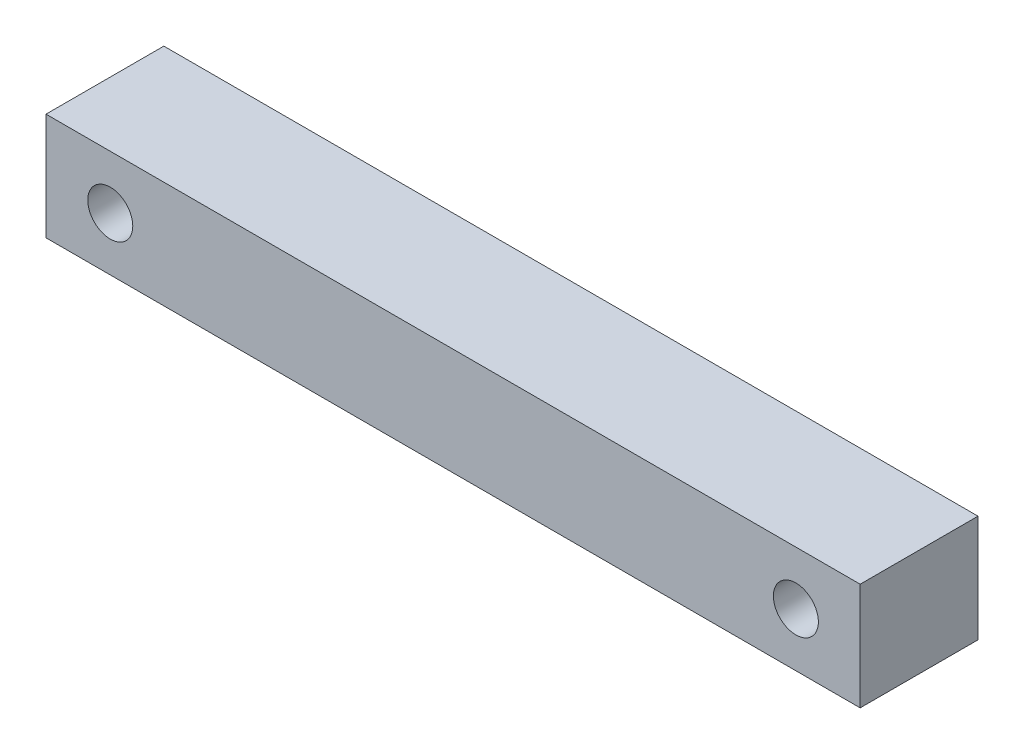
ISO-10303-21;
HEADER;
FILE_DESCRIPTION(('STEP AP214'),'2;1');
FILE_NAME('part.step','',(''),(''),'','','');
FILE_SCHEMA(('AUTOMOTIVE_DESIGN { 1 0 10303 214 1 1 1 1 }'));
ENDSEC;
DATA;
#1=APPLICATION_CONTEXT('core data for automotive mechanical design processes');
#2=APPLICATION_PROTOCOL_DEFINITION('international standard','automotive_design',2000,#1);
#3=PRODUCT_CONTEXT('',#1,'mechanical');
#4=PRODUCT('Part','Part','',(#3));
#5=PRODUCT_RELATED_PRODUCT_CATEGORY('part','',(#4));
#6=PRODUCT_DEFINITION_FORMATION('','',#4);
#7=PRODUCT_DEFINITION_CONTEXT('part definition',#1,'design');
#8=PRODUCT_DEFINITION('design','',#6,#7);
#9=PRODUCT_DEFINITION_SHAPE('','',#8);
#10=(LENGTH_UNIT() NAMED_UNIT(*) SI_UNIT(.MILLI.,.METRE.));
#11=(NAMED_UNIT(*) PLANE_ANGLE_UNIT() SI_UNIT($,.RADIAN.));
#12=(NAMED_UNIT(*) SI_UNIT($,.STERADIAN.) SOLID_ANGLE_UNIT());
#13=UNCERTAINTY_MEASURE_WITH_UNIT(LENGTH_MEASURE(1.E-05),#10,'distance_accuracy_value','');
#14=(GEOMETRIC_REPRESENTATION_CONTEXT(3) GLOBAL_UNCERTAINTY_ASSIGNED_CONTEXT((#13)) GLOBAL_UNIT_ASSIGNED_CONTEXT((#10,
#11,#12)) REPRESENTATION_CONTEXT('',''));
#15=CARTESIAN_POINT('',(0.,0.,0.));
#16=DIRECTION('',(0.,0.,1.));
#17=DIRECTION('',(1.,0.,0.));
#18=AXIS2_PLACEMENT_3D('',#15,#16,#17);
#19=CARTESIAN_POINT('',(0.,0.,5.5));
#20=DIRECTION('',(0.,0.,1.));
#21=DIRECTION('',(1.,0.,0.));
#22=AXIS2_PLACEMENT_3D('',#19,#20,#21);
#23=PLANE('',#22);
#24=CARTESIAN_POINT('',(-16.,0.,5.5));
#25=DIRECTION('',(0.,0.,1.));
#26=DIRECTION('',(1.,0.,0.));
#27=AXIS2_PLACEMENT_3D('',#24,#25,#26);
#28=CIRCLE('',#27,1.05);
#29=CARTESIAN_POINT('',(-14.95,0.,5.5));
#30=VERTEX_POINT('',#29);
#31=EDGE_CURVE('E100',#30,#30,#28,.T.);
#32=ORIENTED_EDGE('',*,*,#31,.F.);
#33=EDGE_LOOP('',(#32));
#34=FACE_BOUND('',#33,.T.);
#35=DIRECTION('',(0.,1.,0.));
#36=VECTOR('',#35,1.);
#37=CARTESIAN_POINT('',(19.,2.5,5.5));
#38=LINE('',#37,#36);
#39=CARTESIAN_POINT('',(19.,-2.5,5.5));
#40=VERTEX_POINT('',#39);
#41=CARTESIAN_POINT('',(19.,2.5,5.5));
#42=VERTEX_POINT('',#41);
#43=EDGE_CURVE('E85',#40,#42,#38,.T.);
#44=ORIENTED_EDGE('',*,*,#43,.T.);
#45=DIRECTION('',(-1.,0.,0.));
#46=VECTOR('',#45,1.);
#47=CARTESIAN_POINT('',(-19.,2.5,5.5));
#48=LINE('',#47,#46);
#49=CARTESIAN_POINT('',(-19.,2.5,5.5));
#50=VERTEX_POINT('',#49);
#51=EDGE_CURVE('E80',#42,#50,#48,.T.);
#52=ORIENTED_EDGE('',*,*,#51,.T.);
#53=DIRECTION('',(0.,-1.,0.));
#54=VECTOR('',#53,1.);
#55=CARTESIAN_POINT('',(-19.,2.5,5.5));
#56=LINE('',#55,#54);
#57=CARTESIAN_POINT('',(-19.,-2.5,5.5));
#58=VERTEX_POINT('',#57);
#59=EDGE_CURVE('E83',#50,#58,#56,.T.);
#60=ORIENTED_EDGE('',*,*,#59,.T.);
#61=DIRECTION('',(1.,0.,0.));
#62=VECTOR('',#61,1.);
#63=CARTESIAN_POINT('',(-19.,-2.5,5.5));
#64=LINE('',#63,#62);
#65=EDGE_CURVE('E50',#58,#40,#64,.T.);
#66=ORIENTED_EDGE('',*,*,#65,.T.);
#67=EDGE_LOOP('',(#44,#52,#60,#66));
#68=FACE_BOUND('',#67,.T.);
#69=CARTESIAN_POINT('',(16.,0.,5.5));
#70=DIRECTION('',(0.,0.,1.));
#71=DIRECTION('',(1.,0.,0.));
#72=AXIS2_PLACEMENT_3D('',#69,#70,#71);
#73=CIRCLE('',#72,1.05);
#74=CARTESIAN_POINT('',(17.05,0.,5.5));
#75=VERTEX_POINT('',#74);
#76=EDGE_CURVE('E115',#75,#75,#73,.T.);
#77=ORIENTED_EDGE('',*,*,#76,.F.);
#78=EDGE_LOOP('',(#77));
#79=FACE_BOUND('',#78,.T.);
#80=ADVANCED_FACE('F33',(#34,#68,#79),#23,.T.);
#81=CARTESIAN_POINT('',(0.,0.,0.));
#82=DIRECTION('',(0.,0.,1.));
#83=DIRECTION('',(1.,0.,0.));
#84=AXIS2_PLACEMENT_3D('',#81,#82,#83);
#85=PLANE('',#84);
#86=DIRECTION('',(0.,1.,0.));
#87=VECTOR('',#86,1.);
#88=CARTESIAN_POINT('',(19.,2.5,0.));
#89=LINE('',#88,#87);
#90=CARTESIAN_POINT('',(19.,-2.5,0.));
#91=VERTEX_POINT('',#90);
#92=CARTESIAN_POINT('',(19.,2.5,0.));
#93=VERTEX_POINT('',#92);
#94=EDGE_CURVE('E97',#91,#93,#89,.T.);
#95=ORIENTED_EDGE('',*,*,#94,.F.);
#96=DIRECTION('',(1.,0.,0.));
#97=VECTOR('',#96,1.);
#98=CARTESIAN_POINT('',(-19.,-2.5,0.));
#99=LINE('',#98,#97);
#100=CARTESIAN_POINT('',(-19.,-2.5,0.));
#101=VERTEX_POINT('',#100);
#102=EDGE_CURVE('E73',#101,#91,#99,.T.);
#103=ORIENTED_EDGE('',*,*,#102,.F.);
#104=DIRECTION('',(0.,-1.,0.));
#105=VECTOR('',#104,1.);
#106=CARTESIAN_POINT('',(-19.,2.5,0.));
#107=LINE('',#106,#105);
#108=CARTESIAN_POINT('',(-19.,2.5,0.));
#109=VERTEX_POINT('',#108);
#110=EDGE_CURVE('E67',#109,#101,#107,.T.);
#111=ORIENTED_EDGE('',*,*,#110,.F.);
#112=DIRECTION('',(-1.,0.,0.));
#113=VECTOR('',#112,1.);
#114=CARTESIAN_POINT('',(-19.,2.5,0.));
#115=LINE('',#114,#113);
#116=EDGE_CURVE('E89',#93,#109,#115,.T.);
#117=ORIENTED_EDGE('',*,*,#116,.F.);
#118=EDGE_LOOP('',(#95,#103,#111,#117));
#119=FACE_BOUND('',#118,.T.);
#120=CARTESIAN_POINT('',(-16.,0.,0.));
#121=DIRECTION('',(0.,0.,1.));
#122=DIRECTION('',(1.,0.,0.));
#123=AXIS2_PLACEMENT_3D('',#120,#121,#122);
#124=CIRCLE('',#123,1.05);
#125=CARTESIAN_POINT('',(-14.95,0.,0.));
#126=VERTEX_POINT('',#125);
#127=EDGE_CURVE('E112',#126,#126,#124,.T.);
#128=ORIENTED_EDGE('',*,*,#127,.T.);
#129=EDGE_LOOP('',(#128));
#130=FACE_BOUND('',#129,.T.);
#131=CARTESIAN_POINT('',(16.,0.,0.));
#132=DIRECTION('',(0.,0.,1.));
#133=DIRECTION('',(1.,0.,0.));
#134=AXIS2_PLACEMENT_3D('',#131,#132,#133);
#135=CIRCLE('',#134,1.05);
#136=CARTESIAN_POINT('',(17.05,0.,0.));
#137=VERTEX_POINT('',#136);
#138=EDGE_CURVE('E118',#137,#137,#135,.T.);
#139=ORIENTED_EDGE('',*,*,#138,.T.);
#140=EDGE_LOOP('',(#139));
#141=FACE_BOUND('',#140,.T.);
#142=ADVANCED_FACE('F108',(#119,#130,#141),#85,.F.);
#143=CARTESIAN_POINT('',(19.,2.5,5.5));
#144=DIRECTION('',(-1.,0.,0.));
#145=DIRECTION('',(0.,0.,1.));
#146=AXIS2_PLACEMENT_3D('',#143,#144,#145);
#147=PLANE('',#146);
#148=ORIENTED_EDGE('',*,*,#94,.T.);
#149=DIRECTION('',(0.,0.,-1.));
#150=VECTOR('',#149,1.);
#151=CARTESIAN_POINT('',(19.,2.5,5.5));
#152=LINE('',#151,#150);
#153=EDGE_CURVE('E11',#42,#93,#152,.T.);
#154=ORIENTED_EDGE('',*,*,#153,.F.);
#155=ORIENTED_EDGE('',*,*,#43,.F.);
#156=DIRECTION('',(0.,0.,-1.));
#157=VECTOR('',#156,1.);
#158=CARTESIAN_POINT('',(19.,-2.5,5.5));
#159=LINE('',#158,#157);
#160=EDGE_CURVE('E93',#40,#91,#159,.T.);
#161=ORIENTED_EDGE('',*,*,#160,.T.);
#162=EDGE_LOOP('',(#148,#154,#155,#161));
#163=FACE_BOUND('',#162,.T.);
#164=ADVANCED_FACE('F35',(#163),#147,.F.);
#165=CARTESIAN_POINT('',(-19.,2.5,5.5));
#166=DIRECTION('',(0.,-1.,0.));
#167=DIRECTION('',(0.,0.,-1.));
#168=AXIS2_PLACEMENT_3D('',#165,#166,#167);
#169=PLANE('',#168);
#170=ORIENTED_EDGE('',*,*,#116,.T.);
#171=DIRECTION('',(0.,0.,-1.));
#172=VECTOR('',#171,1.);
#173=CARTESIAN_POINT('',(-19.,2.5,5.5));
#174=LINE('',#173,#172);
#175=EDGE_CURVE('E42',#50,#109,#174,.T.);
#176=ORIENTED_EDGE('',*,*,#175,.F.);
#177=ORIENTED_EDGE('',*,*,#51,.F.);
#178=ORIENTED_EDGE('',*,*,#153,.T.);
#179=EDGE_LOOP('',(#170,#176,#177,#178));
#180=FACE_BOUND('',#179,.T.);
#181=ADVANCED_FACE('F88',(#180),#169,.F.);
#182=CARTESIAN_POINT('',(-19.,2.5,5.5));
#183=DIRECTION('',(1.,0.,0.));
#184=DIRECTION('',(0.,0.,-1.));
#185=AXIS2_PLACEMENT_3D('',#182,#183,#184);
#186=PLANE('',#185);
#187=ORIENTED_EDGE('',*,*,#110,.T.);
#188=DIRECTION('',(0.,0.,-1.));
#189=VECTOR('',#188,1.);
#190=CARTESIAN_POINT('',(-19.,-2.5,5.5));
#191=LINE('',#190,#189);
#192=EDGE_CURVE('E90',#58,#101,#191,.T.);
#193=ORIENTED_EDGE('',*,*,#192,.F.);
#194=ORIENTED_EDGE('',*,*,#59,.F.);
#195=ORIENTED_EDGE('',*,*,#175,.T.);
#196=EDGE_LOOP('',(#187,#193,#194,#195));
#197=FACE_BOUND('',#196,.T.);
#198=ADVANCED_FACE('F91',(#197),#186,.F.);
#199=CARTESIAN_POINT('',(-19.,-2.5,5.5));
#200=DIRECTION('',(0.,1.,0.));
#201=DIRECTION('',(0.,0.,1.));
#202=AXIS2_PLACEMENT_3D('',#199,#200,#201);
#203=PLANE('',#202);
#204=ORIENTED_EDGE('',*,*,#102,.T.);
#205=ORIENTED_EDGE('',*,*,#160,.F.);
#206=ORIENTED_EDGE('',*,*,#65,.F.);
#207=ORIENTED_EDGE('',*,*,#192,.T.);
#208=EDGE_LOOP('',(#204,#205,#206,#207));
#209=FACE_BOUND('',#208,.T.);
#210=ADVANCED_FACE('F105',(#209),#203,.F.);
#211=CARTESIAN_POINT('',(-16.,0.,5.5));
#212=DIRECTION('',(0.,0.,-1.));
#213=DIRECTION('',(-1.,0.,0.));
#214=AXIS2_PLACEMENT_3D('',#211,#212,#213);
#215=CYLINDRICAL_SURFACE('',#214,1.05);
#216=ORIENTED_EDGE('',*,*,#31,.T.);
#217=EDGE_LOOP('',(#216));
#218=FACE_BOUND('',#217,.T.);
#219=ORIENTED_EDGE('',*,*,#127,.F.);
#220=EDGE_LOOP('',(#219));
#221=FACE_BOUND('',#220,.T.);
#222=ADVANCED_FACE('F135',(#218,#221),#215,.F.);
#223=CARTESIAN_POINT('',(16.,0.,5.5));
#224=DIRECTION('',(0.,0.,-1.));
#225=DIRECTION('',(-1.,0.,0.));
#226=AXIS2_PLACEMENT_3D('',#223,#224,#225);
#227=CYLINDRICAL_SURFACE('',#226,1.05);
#228=ORIENTED_EDGE('',*,*,#76,.T.);
#229=EDGE_LOOP('',(#228));
#230=FACE_BOUND('',#229,.T.);
#231=ORIENTED_EDGE('',*,*,#138,.F.);
#232=EDGE_LOOP('',(#231));
#233=FACE_BOUND('',#232,.T.);
#234=ADVANCED_FACE('F124',(#230,#233),#227,.F.);
#235=CLOSED_SHELL('',(#80,#142,#164,#181,#198,#210,#222,#234));
#236=MANIFOLD_SOLID_BREP('B2',#235);
#237=ADVANCED_BREP_SHAPE_REPRESENTATION('',(#18,#236),#14);
#238=SHAPE_DEFINITION_REPRESENTATION(#9,#237);
ENDSEC;
END-ISO-10303-21;
